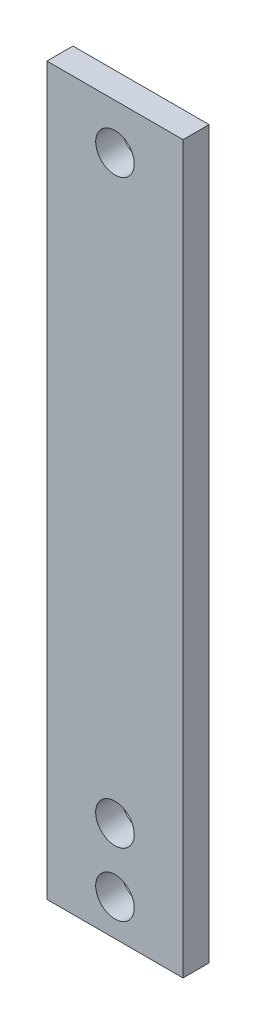
ISO-10303-21;
HEADER;
FILE_DESCRIPTION(('STEP AP214'),'2;1');
FILE_NAME('part.step','',(''),(''),'','','');
FILE_SCHEMA(('AUTOMOTIVE_DESIGN { 1 0 10303 214 1 1 1 1 }'));
ENDSEC;
DATA;
#1=APPLICATION_CONTEXT('core data for automotive mechanical design processes');
#2=APPLICATION_PROTOCOL_DEFINITION('international standard','automotive_design',2000,#1);
#3=PRODUCT_CONTEXT('',#1,'mechanical');
#4=PRODUCT('Part','Part','',(#3));
#5=PRODUCT_RELATED_PRODUCT_CATEGORY('part','',(#4));
#6=PRODUCT_DEFINITION_FORMATION('','',#4);
#7=PRODUCT_DEFINITION_CONTEXT('part definition',#1,'design');
#8=PRODUCT_DEFINITION('design','',#6,#7);
#9=PRODUCT_DEFINITION_SHAPE('','',#8);
#10=(LENGTH_UNIT() NAMED_UNIT(*) SI_UNIT(.MILLI.,.METRE.));
#11=(NAMED_UNIT(*) PLANE_ANGLE_UNIT() SI_UNIT($,.RADIAN.));
#12=(NAMED_UNIT(*) SI_UNIT($,.STERADIAN.) SOLID_ANGLE_UNIT());
#13=UNCERTAINTY_MEASURE_WITH_UNIT(LENGTH_MEASURE(1.E-05),#10,'distance_accuracy_value','');
#14=(GEOMETRIC_REPRESENTATION_CONTEXT(3) GLOBAL_UNCERTAINTY_ASSIGNED_CONTEXT((#13)) GLOBAL_UNIT_ASSIGNED_CONTEXT((#10,
#11,#12)) REPRESENTATION_CONTEXT('',''));
#15=CARTESIAN_POINT('',(0.,0.,0.));
#16=DIRECTION('',(0.,0.,1.));
#17=DIRECTION('',(1.,0.,0.));
#18=AXIS2_PLACEMENT_3D('',#15,#16,#17);
#19=CARTESIAN_POINT('',(0.,0.,2.87));
#20=DIRECTION('',(0.,0.,1.));
#21=DIRECTION('',(1.,0.,0.));
#22=AXIS2_PLACEMENT_3D('',#19,#20,#21);
#23=PLANE('',#22);
#24=CARTESIAN_POINT('',(0.,-29.,2.87));
#25=DIRECTION('',(0.,0.,1.));
#26=DIRECTION('',(1.,0.,0.));
#27=AXIS2_PLACEMENT_3D('',#24,#25,#26);
#28=CIRCLE('',#27,2.125);
#29=CARTESIAN_POINT('',(2.125,-29.,2.87));
#30=VERTEX_POINT('',#29);
#31=EDGE_CURVE('E136',#30,#30,#28,.T.);
#32=ORIENTED_EDGE('',*,*,#31,.F.);
#33=EDGE_LOOP('',(#32));
#34=FACE_BOUND('',#33,.T.);
#35=DIRECTION('',(0.,1.,0.));
#36=VECTOR('',#35,1.);
#37=CARTESIAN_POINT('',(7.5,40.,2.87));
#38=LINE('',#37,#36);
#39=CARTESIAN_POINT('',(7.50000000000001,-40.,2.87));
#40=VERTEX_POINT('',#39);
#41=CARTESIAN_POINT('',(7.5,40.,2.87));
#42=VERTEX_POINT('',#41);
#43=EDGE_CURVE('E94',#40,#42,#38,.T.);
#44=ORIENTED_EDGE('',*,*,#43,.T.);
#45=DIRECTION('',(-1.,0.,0.));
#46=VECTOR('',#45,1.);
#47=CARTESIAN_POINT('',(-7.5,40.,2.87));
#48=LINE('',#47,#46);
#49=CARTESIAN_POINT('',(-7.5,40.,2.87));
#50=VERTEX_POINT('',#49);
#51=EDGE_CURVE('E89',#42,#50,#48,.T.);
#52=ORIENTED_EDGE('',*,*,#51,.T.);
#53=DIRECTION('',(0.,-1.,0.));
#54=VECTOR('',#53,1.);
#55=CARTESIAN_POINT('',(-7.5,40.,2.87));
#56=LINE('',#55,#54);
#57=CARTESIAN_POINT('',(-7.49999999999999,-40.,2.87));
#58=VERTEX_POINT('',#57);
#59=EDGE_CURVE('E92',#50,#58,#56,.T.);
#60=ORIENTED_EDGE('',*,*,#59,.T.);
#61=DIRECTION('',(1.,0.,0.));
#62=VECTOR('',#61,1.);
#63=CARTESIAN_POINT('',(-7.49999999999999,-40.,2.87));
#64=LINE('',#63,#62);
#65=EDGE_CURVE('E59',#58,#40,#64,.T.);
#66=ORIENTED_EDGE('',*,*,#65,.T.);
#67=EDGE_LOOP('',(#44,#52,#60,#66));
#68=FACE_BOUND('',#67,.T.);
#69=CARTESIAN_POINT('',(0.,-36.,2.87));
#70=DIRECTION('',(0.,0.,1.));
#71=DIRECTION('',(1.,0.,0.));
#72=AXIS2_PLACEMENT_3D('',#69,#70,#71);
#73=CIRCLE('',#72,2.125);
#74=CARTESIAN_POINT('',(2.125,-36.,2.87));
#75=VERTEX_POINT('',#74);
#76=EDGE_CURVE('E114',#75,#75,#73,.T.);
#77=ORIENTED_EDGE('',*,*,#76,.F.);
#78=EDGE_LOOP('',(#77));
#79=FACE_BOUND('',#78,.T.);
#80=CARTESIAN_POINT('',(0.,35.,2.87));
#81=DIRECTION('',(0.,0.,1.));
#82=DIRECTION('',(1.,0.,0.));
#83=AXIS2_PLACEMENT_3D('',#80,#81,#82);
#84=CIRCLE('',#83,2.125);
#85=CARTESIAN_POINT('',(2.125,35.,2.87));
#86=VERTEX_POINT('',#85);
#87=EDGE_CURVE('E144',#86,#86,#84,.T.);
#88=ORIENTED_EDGE('',*,*,#87,.F.);
#89=EDGE_LOOP('',(#88));
#90=FACE_BOUND('',#89,.T.);
#91=ADVANCED_FACE('F41',(#34,#68,#79,#90),#23,.T.);
#92=CARTESIAN_POINT('',(0.,0.,0.));
#93=DIRECTION('',(0.,0.,1.));
#94=DIRECTION('',(1.,0.,0.));
#95=AXIS2_PLACEMENT_3D('',#92,#93,#94);
#96=PLANE('',#95);
#97=DIRECTION('',(0.,1.,0.));
#98=VECTOR('',#97,1.);
#99=CARTESIAN_POINT('',(7.5,40.,0.));
#100=LINE('',#99,#98);
#101=CARTESIAN_POINT('',(7.50000000000001,-40.,0.));
#102=VERTEX_POINT('',#101);
#103=CARTESIAN_POINT('',(7.5,40.,0.));
#104=VERTEX_POINT('',#103);
#105=EDGE_CURVE('E110',#102,#104,#100,.T.);
#106=ORIENTED_EDGE('',*,*,#105,.F.);
#107=DIRECTION('',(1.,0.,0.));
#108=VECTOR('',#107,1.);
#109=CARTESIAN_POINT('',(-7.49999999999999,-40.,0.));
#110=LINE('',#109,#108);
#111=CARTESIAN_POINT('',(-7.49999999999999,-40.,0.));
#112=VERTEX_POINT('',#111);
#113=EDGE_CURVE('E82',#112,#102,#110,.T.);
#114=ORIENTED_EDGE('',*,*,#113,.F.);
#115=DIRECTION('',(0.,-1.,0.));
#116=VECTOR('',#115,1.);
#117=CARTESIAN_POINT('',(-7.5,40.,0.));
#118=LINE('',#117,#116);
#119=CARTESIAN_POINT('',(-7.5,40.,0.));
#120=VERTEX_POINT('',#119);
#121=EDGE_CURVE('E76',#120,#112,#118,.T.);
#122=ORIENTED_EDGE('',*,*,#121,.F.);
#123=DIRECTION('',(-1.,0.,0.));
#124=VECTOR('',#123,1.);
#125=CARTESIAN_POINT('',(-7.5,40.,0.));
#126=LINE('',#125,#124);
#127=EDGE_CURVE('E99',#104,#120,#126,.T.);
#128=ORIENTED_EDGE('',*,*,#127,.F.);
#129=EDGE_LOOP('',(#106,#114,#122,#128));
#130=FACE_BOUND('',#129,.T.);
#131=CARTESIAN_POINT('',(0.,-36.,0.));
#132=DIRECTION('',(0.,0.,1.));
#133=DIRECTION('',(1.,0.,0.));
#134=AXIS2_PLACEMENT_3D('',#131,#132,#133);
#135=CIRCLE('',#134,2.125);
#136=CARTESIAN_POINT('',(2.125,-36.,0.));
#137=VERTEX_POINT('',#136);
#138=EDGE_CURVE('E132',#137,#137,#135,.T.);
#139=ORIENTED_EDGE('',*,*,#138,.T.);
#140=EDGE_LOOP('',(#139));
#141=FACE_BOUND('',#140,.T.);
#142=CARTESIAN_POINT('',(0.,-29.,0.));
#143=DIRECTION('',(0.,0.,1.));
#144=DIRECTION('',(1.,0.,0.));
#145=AXIS2_PLACEMENT_3D('',#142,#143,#144);
#146=CIRCLE('',#145,2.125);
#147=CARTESIAN_POINT('',(2.125,-29.,0.));
#148=VERTEX_POINT('',#147);
#149=EDGE_CURVE('E140',#148,#148,#146,.T.);
#150=ORIENTED_EDGE('',*,*,#149,.T.);
#151=EDGE_LOOP('',(#150));
#152=FACE_BOUND('',#151,.T.);
#153=CARTESIAN_POINT('',(0.,35.,0.));
#154=DIRECTION('',(0.,0.,1.));
#155=DIRECTION('',(1.,0.,0.));
#156=AXIS2_PLACEMENT_3D('',#153,#154,#155);
#157=CIRCLE('',#156,2.125);
#158=CARTESIAN_POINT('',(2.125,35.,0.));
#159=VERTEX_POINT('',#158);
#160=EDGE_CURVE('E148',#159,#159,#157,.T.);
#161=ORIENTED_EDGE('',*,*,#160,.T.);
#162=EDGE_LOOP('',(#161));
#163=FACE_BOUND('',#162,.T.);
#164=ADVANCED_FACE('F127',(#130,#141,#152,#163),#96,.F.);
#165=CARTESIAN_POINT('',(7.5,40.,2.87));
#166=DIRECTION('',(-1.,0.,0.));
#167=DIRECTION('',(0.,-1.,0.));
#168=AXIS2_PLACEMENT_3D('',#165,#166,#167);
#169=PLANE('',#168);
#170=ORIENTED_EDGE('',*,*,#105,.T.);
#171=DIRECTION('',(0.,0.,-1.));
#172=VECTOR('',#171,1.);
#173=CARTESIAN_POINT('',(7.5,40.,2.87));
#174=LINE('',#173,#172);
#175=EDGE_CURVE('E11',#42,#104,#174,.T.);
#176=ORIENTED_EDGE('',*,*,#175,.F.);
#177=ORIENTED_EDGE('',*,*,#43,.F.);
#178=DIRECTION('',(0.,0.,-1.));
#179=VECTOR('',#178,1.);
#180=CARTESIAN_POINT('',(7.50000000000001,-40.,2.87));
#181=LINE('',#180,#179);
#182=EDGE_CURVE('E106',#40,#102,#181,.T.);
#183=ORIENTED_EDGE('',*,*,#182,.T.);
#184=EDGE_LOOP('',(#170,#176,#177,#183));
#185=FACE_BOUND('',#184,.T.);
#186=ADVANCED_FACE('F43',(#185),#169,.F.);
#187=CARTESIAN_POINT('',(-7.5,40.,2.87));
#188=DIRECTION('',(0.,-1.,0.));
#189=DIRECTION('',(0.,0.,-1.));
#190=AXIS2_PLACEMENT_3D('',#187,#188,#189);
#191=PLANE('',#190);
#192=ORIENTED_EDGE('',*,*,#127,.T.);
#193=DIRECTION('',(0.,0.,-1.));
#194=VECTOR('',#193,1.);
#195=CARTESIAN_POINT('',(-7.5,40.,2.87));
#196=LINE('',#195,#194);
#197=EDGE_CURVE('E51',#50,#120,#196,.T.);
#198=ORIENTED_EDGE('',*,*,#197,.F.);
#199=ORIENTED_EDGE('',*,*,#51,.F.);
#200=ORIENTED_EDGE('',*,*,#175,.T.);
#201=EDGE_LOOP('',(#192,#198,#199,#200));
#202=FACE_BOUND('',#201,.T.);
#203=ADVANCED_FACE('F98',(#202),#191,.F.);
#204=CARTESIAN_POINT('',(-7.5,40.,2.87));
#205=DIRECTION('',(1.,0.,0.));
#206=DIRECTION('',(0.,1.,0.));
#207=AXIS2_PLACEMENT_3D('',#204,#205,#206);
#208=PLANE('',#207);
#209=ORIENTED_EDGE('',*,*,#121,.T.);
#210=DIRECTION('',(0.,0.,-1.));
#211=VECTOR('',#210,1.);
#212=CARTESIAN_POINT('',(-7.49999999999999,-40.,2.87));
#213=LINE('',#212,#211);
#214=EDGE_CURVE('E101',#58,#112,#213,.T.);
#215=ORIENTED_EDGE('',*,*,#214,.F.);
#216=ORIENTED_EDGE('',*,*,#59,.F.);
#217=ORIENTED_EDGE('',*,*,#197,.T.);
#218=EDGE_LOOP('',(#209,#215,#216,#217));
#219=FACE_BOUND('',#218,.T.);
#220=ADVANCED_FACE('F102',(#219),#208,.F.);
#221=CARTESIAN_POINT('',(-7.49999999999999,-40.,2.87));
#222=DIRECTION('',(0.,1.,0.));
#223=DIRECTION('',(0.,0.,1.));
#224=AXIS2_PLACEMENT_3D('',#221,#222,#223);
#225=PLANE('',#224);
#226=ORIENTED_EDGE('',*,*,#113,.T.);
#227=ORIENTED_EDGE('',*,*,#182,.F.);
#228=ORIENTED_EDGE('',*,*,#65,.F.);
#229=ORIENTED_EDGE('',*,*,#214,.T.);
#230=EDGE_LOOP('',(#226,#227,#228,#229));
#231=FACE_BOUND('',#230,.T.);
#232=ADVANCED_FACE('F124',(#231),#225,.F.);
#233=CARTESIAN_POINT('',(0.,-36.,2.87));
#234=DIRECTION('',(0.,0.,-1.));
#235=DIRECTION('',(-1.,0.,0.));
#236=AXIS2_PLACEMENT_3D('',#233,#234,#235);
#237=CYLINDRICAL_SURFACE('',#236,2.125);
#238=ORIENTED_EDGE('',*,*,#76,.T.);
#239=EDGE_LOOP('',(#238));
#240=FACE_BOUND('',#239,.T.);
#241=ORIENTED_EDGE('',*,*,#138,.F.);
#242=EDGE_LOOP('',(#241));
#243=FACE_BOUND('',#242,.T.);
#244=ADVANCED_FACE('F168',(#240,#243),#237,.F.);
#245=CARTESIAN_POINT('',(0.,-29.,2.87));
#246=DIRECTION('',(0.,0.,-1.));
#247=DIRECTION('',(-1.,0.,0.));
#248=AXIS2_PLACEMENT_3D('',#245,#246,#247);
#249=CYLINDRICAL_SURFACE('',#248,2.125);
#250=ORIENTED_EDGE('',*,*,#31,.T.);
#251=EDGE_LOOP('',(#250));
#252=FACE_BOUND('',#251,.T.);
#253=ORIENTED_EDGE('',*,*,#149,.F.);
#254=EDGE_LOOP('',(#253));
#255=FACE_BOUND('',#254,.T.);
#256=ADVANCED_FACE('F214',(#252,#255),#249,.F.);
#257=CARTESIAN_POINT('',(0.,35.,2.87));
#258=DIRECTION('',(0.,0.,-1.));
#259=DIRECTION('',(-1.,0.,0.));
#260=AXIS2_PLACEMENT_3D('',#257,#258,#259);
#261=CYLINDRICAL_SURFACE('',#260,2.125);
#262=ORIENTED_EDGE('',*,*,#87,.T.);
#263=EDGE_LOOP('',(#262));
#264=FACE_BOUND('',#263,.T.);
#265=ORIENTED_EDGE('',*,*,#160,.F.);
#266=EDGE_LOOP('',(#265));
#267=FACE_BOUND('',#266,.T.);
#268=ADVANCED_FACE('F156',(#264,#267),#261,.F.);
#269=CLOSED_SHELL('',(#91,#164,#186,#203,#220,#232,#244,#256,#268));
#270=MANIFOLD_SOLID_BREP('B2',#269);
#271=ADVANCED_BREP_SHAPE_REPRESENTATION('',(#18,#270),#14);
#272=SHAPE_DEFINITION_REPRESENTATION(#9,#271);
ENDSEC;
END-ISO-10303-21;
